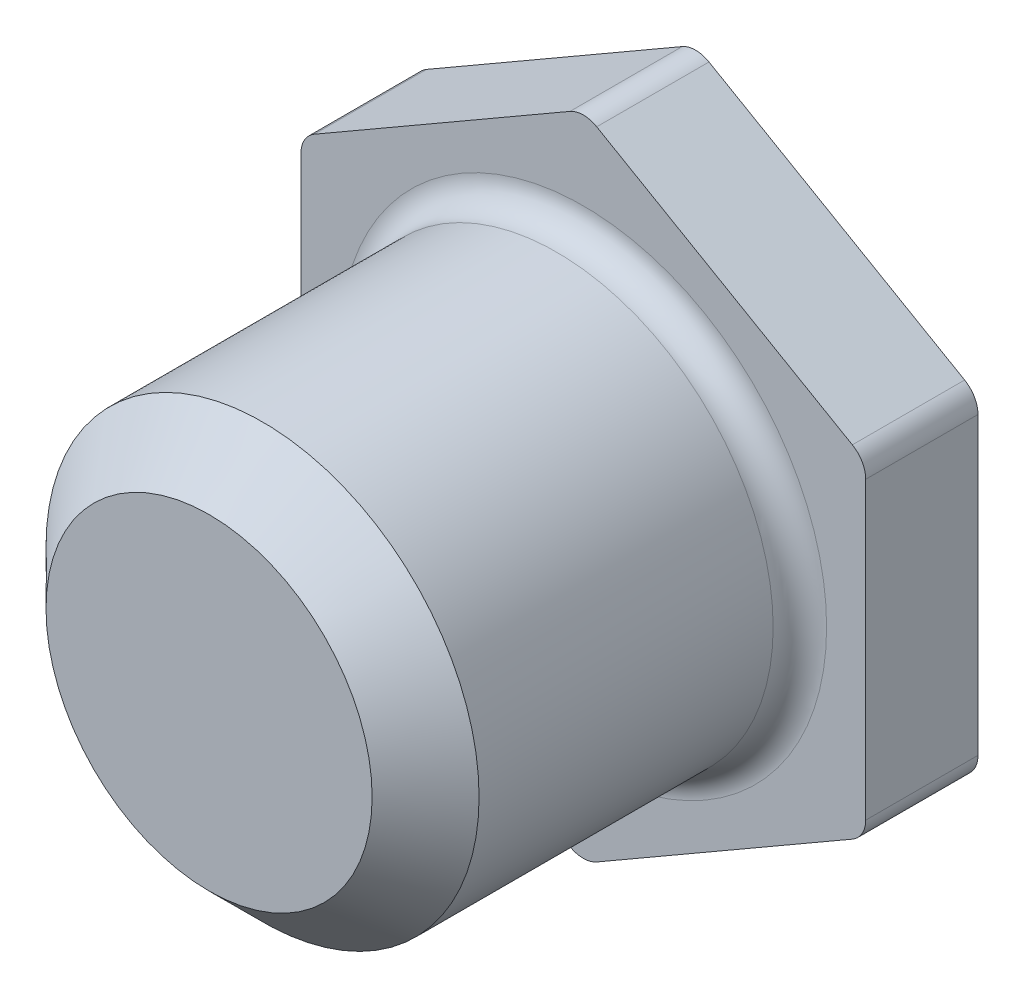
ISO-10303-21;
HEADER;
FILE_DESCRIPTION(('STEP AP214'),'2;1');
FILE_NAME('part.step','',(''),(''),'','','');
FILE_SCHEMA(('AUTOMOTIVE_DESIGN { 1 0 10303 214 1 1 1 1 }'));
ENDSEC;
DATA;
#1=APPLICATION_CONTEXT('core data for automotive mechanical design processes');
#2=APPLICATION_PROTOCOL_DEFINITION('international standard','automotive_design',2000,#1);
#3=PRODUCT_CONTEXT('',#1,'mechanical');
#4=PRODUCT('Part','Part','',(#3));
#5=PRODUCT_RELATED_PRODUCT_CATEGORY('part','',(#4));
#6=PRODUCT_DEFINITION_FORMATION('','',#4);
#7=PRODUCT_DEFINITION_CONTEXT('part definition',#1,'design');
#8=PRODUCT_DEFINITION('design','',#6,#7);
#9=PRODUCT_DEFINITION_SHAPE('','',#8);
#10=(LENGTH_UNIT() NAMED_UNIT(*) SI_UNIT(.MILLI.,.METRE.));
#11=(NAMED_UNIT(*) PLANE_ANGLE_UNIT() SI_UNIT($,.RADIAN.));
#12=(NAMED_UNIT(*) SI_UNIT($,.STERADIAN.) SOLID_ANGLE_UNIT());
#13=UNCERTAINTY_MEASURE_WITH_UNIT(LENGTH_MEASURE(1.E-05),#10,'distance_accuracy_value','');
#14=(GEOMETRIC_REPRESENTATION_CONTEXT(3) GLOBAL_UNCERTAINTY_ASSIGNED_CONTEXT((#13)) GLOBAL_UNIT_ASSIGNED_CONTEXT((#10,
#11,#12)) REPRESENTATION_CONTEXT('',''));
#15=CARTESIAN_POINT('',(0.,0.,0.));
#16=DIRECTION('',(0.,0.,1.));
#17=DIRECTION('',(1.,0.,0.));
#18=AXIS2_PLACEMENT_3D('',#15,#16,#17);
#19=CARTESIAN_POINT('',(5.28131212160006,-3.04916697508023,2.1));
#20=DIRECTION('',(-1.,0.,0.));
#21=DIRECTION('',(0.,-1.,0.));
#22=AXIS2_PLACEMENT_3D('',#19,#20,#21);
#23=PLANE('',#22);
#24=DIRECTION('',(0.,1.,0.));
#25=VECTOR('',#24,1.);
#26=CARTESIAN_POINT('',(5.28131212160006,-3.04916697508023,2.1));
#27=LINE('',#26,#25);
#28=CARTESIAN_POINT('',(5.28131212160006,-2.76049184048542,2.1));
#29=VERTEX_POINT('',#28);
#30=CARTESIAN_POINT('',(5.28131212160006,2.76049184048542,2.1));
#31=VERTEX_POINT('',#30);
#32=EDGE_CURVE('E145',#29,#31,#27,.T.);
#33=ORIENTED_EDGE('',*,*,#32,.F.);
#34=DIRECTION('',(0.,0.,-1.));
#35=VECTOR('',#34,1.);
#36=CARTESIAN_POINT('',(5.28131212160006,-2.76049184048542,2.1));
#37=LINE('',#36,#35);
#38=CARTESIAN_POINT('',(5.28131212160006,-2.76049184048542,0.));
#39=VERTEX_POINT('',#38);
#40=EDGE_CURVE('E159',#29,#39,#37,.T.);
#41=ORIENTED_EDGE('',*,*,#40,.T.);
#42=DIRECTION('',(0.,1.,0.));
#43=VECTOR('',#42,1.);
#44=CARTESIAN_POINT('',(5.28131212160006,-3.04916697508023,0.));
#45=LINE('',#44,#43);
#46=CARTESIAN_POINT('',(5.28131212160006,2.76049184048542,0.));
#47=VERTEX_POINT('',#46);
#48=EDGE_CURVE('E320',#39,#47,#45,.T.);
#49=ORIENTED_EDGE('',*,*,#48,.T.);
#50=DIRECTION('',(0.,0.,-1.));
#51=VECTOR('',#50,1.);
#52=CARTESIAN_POINT('',(5.28131212160006,2.76049184048542,2.1));
#53=LINE('',#52,#51);
#54=EDGE_CURVE('E161',#47,#31,#53,.F.);
#55=ORIENTED_EDGE('',*,*,#54,.T.);
#56=EDGE_LOOP('',(#33,#41,#49,#55));
#57=FACE_BOUND('',#56,.T.);
#58=ADVANCED_FACE('F47',(#57),#23,.F.);
#59=CARTESIAN_POINT('',(5.28131212160006,3.04916697508023,2.1));
#60=DIRECTION('',(-0.5,-0.866025403784439,0.));
#61=DIRECTION('',(0.866025403784439,-0.5,0.));
#62=AXIS2_PLACEMENT_3D('',#59,#60,#61);
#63=PLANE('',#62);
#64=DIRECTION('',(-0.866025403784439,0.5,0.));
#65=VECTOR('',#64,1.);
#66=CARTESIAN_POINT('',(5.28131212160006,3.04916697508023,2.1));
#67=LINE('',#66,#65);
#68=CARTESIAN_POINT('',(5.03131212160006,3.19350454237764,2.1));
#69=VERTEX_POINT('',#68);
#70=CARTESIAN_POINT('',(0.249999999999999,5.95399638286306,2.1));
#71=VERTEX_POINT('',#70);
#72=EDGE_CURVE('E163',#69,#71,#67,.T.);
#73=ORIENTED_EDGE('',*,*,#72,.F.);
#74=DIRECTION('',(0.,0.,-1.));
#75=VECTOR('',#74,1.);
#76=CARTESIAN_POINT('',(5.03131212160006,3.19350454237764,2.1));
#77=LINE('',#76,#75);
#78=CARTESIAN_POINT('',(5.03131212160006,3.19350454237764,0.));
#79=VERTEX_POINT('',#78);
#80=EDGE_CURVE('E173',#69,#79,#77,.T.);
#81=ORIENTED_EDGE('',*,*,#80,.T.);
#82=DIRECTION('',(-0.866025403784439,0.5,0.));
#83=VECTOR('',#82,1.);
#84=CARTESIAN_POINT('',(5.28131212160006,3.04916697508023,0.));
#85=LINE('',#84,#83);
#86=CARTESIAN_POINT('',(0.249999999999999,5.95399638286306,0.));
#87=VERTEX_POINT('',#86);
#88=EDGE_CURVE('E323',#79,#87,#85,.T.);
#89=ORIENTED_EDGE('',*,*,#88,.T.);
#90=DIRECTION('',(0.,0.,-1.));
#91=VECTOR('',#90,1.);
#92=CARTESIAN_POINT('',(0.249999999999999,5.95399638286306,2.1));
#93=LINE('',#92,#91);
#94=EDGE_CURVE('E169',#87,#71,#93,.F.);
#95=ORIENTED_EDGE('',*,*,#94,.T.);
#96=EDGE_LOOP('',(#73,#81,#89,#95));
#97=FACE_BOUND('',#96,.T.);
#98=ADVANCED_FACE('F197',(#97),#63,.F.);
#99=CARTESIAN_POINT('',(0.,6.09833395016046,2.1));
#100=DIRECTION('',(0.5,-0.866025403784439,0.));
#101=DIRECTION('',(0.866025403784439,0.5,0.));
#102=AXIS2_PLACEMENT_3D('',#99,#100,#101);
#103=PLANE('',#102);
#104=DIRECTION('',(-0.866025403784439,-0.5,0.));
#105=VECTOR('',#104,1.);
#106=CARTESIAN_POINT('',(0.,6.09833395016046,0.));
#107=LINE('',#106,#105);
#108=CARTESIAN_POINT('',(-0.250000000000001,5.95399638286306,0.));
#109=VERTEX_POINT('',#108);
#110=CARTESIAN_POINT('',(-5.03131212160006,3.19350454237764,0.));
#111=VERTEX_POINT('',#110);
#112=EDGE_CURVE('E326',#109,#111,#107,.T.);
#113=ORIENTED_EDGE('',*,*,#112,.T.);
#114=DIRECTION('',(0.,0.,-1.));
#115=VECTOR('',#114,1.);
#116=CARTESIAN_POINT('',(-5.03131212160006,3.19350454237764,2.1));
#117=LINE('',#116,#115);
#118=CARTESIAN_POINT('',(-5.03131212160006,3.19350454237764,2.1));
#119=VERTEX_POINT('',#118);
#120=EDGE_CURVE('E276',#111,#119,#117,.F.);
#121=ORIENTED_EDGE('',*,*,#120,.T.);
#122=DIRECTION('',(-0.866025403784439,-0.5,0.));
#123=VECTOR('',#122,1.);
#124=CARTESIAN_POINT('',(0.,6.09833395016046,2.1));
#125=LINE('',#124,#123);
#126=CARTESIAN_POINT('',(-0.250000000000001,5.95399638286306,2.1));
#127=VERTEX_POINT('',#126);
#128=EDGE_CURVE('E360',#127,#119,#125,.T.);
#129=ORIENTED_EDGE('',*,*,#128,.F.);
#130=DIRECTION('',(0.,0.,-1.));
#131=VECTOR('',#130,1.);
#132=CARTESIAN_POINT('',(-0.250000000000001,5.95399638286306,2.1));
#133=LINE('',#132,#131);
#134=EDGE_CURVE('E272',#127,#109,#133,.T.);
#135=ORIENTED_EDGE('',*,*,#134,.T.);
#136=EDGE_LOOP('',(#113,#121,#129,#135));
#137=FACE_BOUND('',#136,.T.);
#138=ADVANCED_FACE('F202',(#137),#103,.F.);
#139=CARTESIAN_POINT('',(-5.28131212160006,3.04916697508023,2.1));
#140=DIRECTION('',(1.,0.,0.));
#141=DIRECTION('',(0.,0.,-1.));
#142=AXIS2_PLACEMENT_3D('',#139,#140,#141);
#143=PLANE('',#142);
#144=DIRECTION('',(0.,-1.,0.));
#145=VECTOR('',#144,1.);
#146=CARTESIAN_POINT('',(-5.28131212160006,3.04916697508023,2.1));
#147=LINE('',#146,#145);
#148=CARTESIAN_POINT('',(-5.28131212160006,2.76049184048542,2.1));
#149=VERTEX_POINT('',#148);
#150=CARTESIAN_POINT('',(-5.28131212160006,-2.76049184048542,2.1));
#151=VERTEX_POINT('',#150);
#152=EDGE_CURVE('E316',#149,#151,#147,.T.);
#153=ORIENTED_EDGE('',*,*,#152,.F.);
#154=DIRECTION('',(0.,0.,-1.));
#155=VECTOR('',#154,1.);
#156=CARTESIAN_POINT('',(-5.28131212160006,2.76049184048542,2.1));
#157=LINE('',#156,#155);
#158=CARTESIAN_POINT('',(-5.28131212160006,2.76049184048542,0.));
#159=VERTEX_POINT('',#158);
#160=EDGE_CURVE('E253',#149,#159,#157,.T.);
#161=ORIENTED_EDGE('',*,*,#160,.T.);
#162=DIRECTION('',(0.,-1.,0.));
#163=VECTOR('',#162,1.);
#164=CARTESIAN_POINT('',(-5.28131212160006,3.04916697508023,0.));
#165=LINE('',#164,#163);
#166=CARTESIAN_POINT('',(-5.28131212160006,-2.76049184048542,0.));
#167=VERTEX_POINT('',#166);
#168=EDGE_CURVE('E304',#159,#167,#165,.T.);
#169=ORIENTED_EDGE('',*,*,#168,.T.);
#170=DIRECTION('',(0.,0.,-1.));
#171=VECTOR('',#170,1.);
#172=CARTESIAN_POINT('',(-5.28131212160006,-2.76049184048542,2.1));
#173=LINE('',#172,#171);
#174=EDGE_CURVE('E250',#167,#151,#173,.F.);
#175=ORIENTED_EDGE('',*,*,#174,.T.);
#176=EDGE_LOOP('',(#153,#161,#169,#175));
#177=FACE_BOUND('',#176,.T.);
#178=ADVANCED_FACE('F334',(#177),#143,.F.);
#179=CARTESIAN_POINT('',(-5.28131212160006,-3.04916697508023,2.1));
#180=DIRECTION('',(0.5,0.866025403784439,0.));
#181=DIRECTION('',(-0.866025403784439,0.5,0.));
#182=AXIS2_PLACEMENT_3D('',#179,#180,#181);
#183=PLANE('',#182);
#184=DIRECTION('',(0.866025403784439,-0.5,0.));
#185=VECTOR('',#184,1.);
#186=CARTESIAN_POINT('',(-5.28131212160006,-3.04916697508023,2.1));
#187=LINE('',#186,#185);
#188=CARTESIAN_POINT('',(-5.03131212160006,-3.19350454237764,2.1));
#189=VERTEX_POINT('',#188);
#190=CARTESIAN_POINT('',(-0.25,-5.95399638286305,2.1));
#191=VERTEX_POINT('',#190);
#192=EDGE_CURVE('E312',#189,#191,#187,.T.);
#193=ORIENTED_EDGE('',*,*,#192,.F.);
#194=DIRECTION('',(0.,0.,-1.));
#195=VECTOR('',#194,1.);
#196=CARTESIAN_POINT('',(-5.03131212160006,-3.19350454237764,2.1));
#197=LINE('',#196,#195);
#198=CARTESIAN_POINT('',(-5.03131212160006,-3.19350454237764,0.));
#199=VERTEX_POINT('',#198);
#200=EDGE_CURVE('E282',#189,#199,#197,.T.);
#201=ORIENTED_EDGE('',*,*,#200,.T.);
#202=DIRECTION('',(0.866025403784439,-0.5,0.));
#203=VECTOR('',#202,1.);
#204=CARTESIAN_POINT('',(-5.28131212160006,-3.04916697508023,0.));
#205=LINE('',#204,#203);
#206=CARTESIAN_POINT('',(-0.25,-5.95399638286305,0.));
#207=VERTEX_POINT('',#206);
#208=EDGE_CURVE('E301',#199,#207,#205,.T.);
#209=ORIENTED_EDGE('',*,*,#208,.T.);
#210=DIRECTION('',(0.,0.,-1.));
#211=VECTOR('',#210,1.);
#212=CARTESIAN_POINT('',(-0.25,-5.95399638286305,2.1));
#213=LINE('',#212,#211);
#214=EDGE_CURVE('E279',#207,#191,#213,.F.);
#215=ORIENTED_EDGE('',*,*,#214,.T.);
#216=EDGE_LOOP('',(#193,#201,#209,#215));
#217=FACE_BOUND('',#216,.T.);
#218=ADVANCED_FACE('F341',(#217),#183,.F.);
#219=CARTESIAN_POINT('',(0.,-6.09833395016046,2.1));
#220=DIRECTION('',(-0.5,0.866025403784439,0.));
#221=DIRECTION('',(-0.866025403784439,-0.5,0.));
#222=AXIS2_PLACEMENT_3D('',#219,#220,#221);
#223=PLANE('',#222);
#224=DIRECTION('',(0.866025403784439,0.5,0.));
#225=VECTOR('',#224,1.);
#226=CARTESIAN_POINT('',(0.,-6.09833395016046,2.1));
#227=LINE('',#226,#225);
#228=CARTESIAN_POINT('',(0.25,-5.95399638286305,2.1));
#229=VERTEX_POINT('',#228);
#230=CARTESIAN_POINT('',(5.03131212160006,-3.19350454237764,2.1));
#231=VERTEX_POINT('',#230);
#232=EDGE_CURVE('E148',#229,#231,#227,.T.);
#233=ORIENTED_EDGE('',*,*,#232,.F.);
#234=DIRECTION('',(0.,0.,-1.));
#235=VECTOR('',#234,1.);
#236=CARTESIAN_POINT('',(0.25,-5.95399638286305,2.1));
#237=LINE('',#236,#235);
#238=CARTESIAN_POINT('',(0.25,-5.95399638286305,0.));
#239=VERTEX_POINT('',#238);
#240=EDGE_CURVE('E175',#229,#239,#237,.T.);
#241=ORIENTED_EDGE('',*,*,#240,.T.);
#242=DIRECTION('',(0.866025403784439,0.5,0.));
#243=VECTOR('',#242,1.);
#244=CARTESIAN_POINT('',(0.,-6.09833395016046,0.));
#245=LINE('',#244,#243);
#246=CARTESIAN_POINT('',(5.03131212160006,-3.19350454237764,0.));
#247=VERTEX_POINT('',#246);
#248=EDGE_CURVE('E164',#239,#247,#245,.T.);
#249=ORIENTED_EDGE('',*,*,#248,.T.);
#250=DIRECTION('',(0.,0.,-1.));
#251=VECTOR('',#250,1.);
#252=CARTESIAN_POINT('',(5.03131212160006,-3.19350454237764,2.1));
#253=LINE('',#252,#251);
#254=EDGE_CURVE('E286',#247,#231,#253,.F.);
#255=ORIENTED_EDGE('',*,*,#254,.T.);
#256=EDGE_LOOP('',(#233,#241,#249,#255));
#257=FACE_BOUND('',#256,.T.);
#258=ADVANCED_FACE('F294',(#257),#223,.F.);
#259=CARTESIAN_POINT('',(0.,0.,2.1));
#260=DIRECTION('',(0.,0.,1.));
#261=DIRECTION('',(1.,0.,0.));
#262=AXIS2_PLACEMENT_3D('',#259,#260,#261);
#263=PLANE('',#262);
#264=CARTESIAN_POINT('',(0.,0.,2.1));
#265=DIRECTION('',(0.,0.,1.));
#266=DIRECTION('',(1.,0.,0.));
#267=AXIS2_PLACEMENT_3D('',#264,#265,#266);
#268=CIRCLE('',#267,4.55);
#269=CARTESIAN_POINT('',(4.55,0.,2.1));
#270=VERTEX_POINT('',#269);
#271=EDGE_CURVE('E246',#270,#270,#268,.F.);
#272=ORIENTED_EDGE('',*,*,#271,.T.);
#273=EDGE_LOOP('',(#272));
#274=FACE_BOUND('',#273,.T.);
#275=ORIENTED_EDGE('',*,*,#128,.T.);
#276=CARTESIAN_POINT('',(-4.78131212160006,2.76049184048542,2.1));
#277=DIRECTION('',(0.,0.,1.));
#278=DIRECTION('',(1.,0.,0.));
#279=AXIS2_PLACEMENT_3D('',#276,#277,#278);
#280=CIRCLE('',#279,0.5);
#281=EDGE_CURVE('E243',#119,#149,#280,.T.);
#282=ORIENTED_EDGE('',*,*,#281,.T.);
#283=ORIENTED_EDGE('',*,*,#152,.T.);
#284=CARTESIAN_POINT('',(-4.78131212160006,-2.76049184048542,2.1));
#285=DIRECTION('',(0.,0.,1.));
#286=DIRECTION('',(1.,0.,0.));
#287=AXIS2_PLACEMENT_3D('',#284,#285,#286);
#288=CIRCLE('',#287,0.5);
#289=EDGE_CURVE('E240',#151,#189,#288,.T.);
#290=ORIENTED_EDGE('',*,*,#289,.T.);
#291=ORIENTED_EDGE('',*,*,#192,.T.);
#292=CARTESIAN_POINT('',(0.,-5.52098368097083,2.1));
#293=DIRECTION('',(0.,0.,1.));
#294=DIRECTION('',(1.,0.,0.));
#295=AXIS2_PLACEMENT_3D('',#292,#293,#294);
#296=CIRCLE('',#295,0.5);
#297=EDGE_CURVE('E153',#191,#229,#296,.T.);
#298=ORIENTED_EDGE('',*,*,#297,.T.);
#299=ORIENTED_EDGE('',*,*,#232,.T.);
#300=CARTESIAN_POINT('',(4.78131212160006,-2.76049184048542,2.1));
#301=DIRECTION('',(0.,0.,1.));
#302=DIRECTION('',(1.,0.,0.));
#303=AXIS2_PLACEMENT_3D('',#300,#301,#302);
#304=CIRCLE('',#303,0.5);
#305=EDGE_CURVE('E141',#231,#29,#304,.T.);
#306=ORIENTED_EDGE('',*,*,#305,.T.);
#307=ORIENTED_EDGE('',*,*,#32,.T.);
#308=CARTESIAN_POINT('',(4.78131212160006,2.76049184048542,2.1));
#309=DIRECTION('',(0.,0.,1.));
#310=DIRECTION('',(1.,0.,0.));
#311=AXIS2_PLACEMENT_3D('',#308,#309,#310);
#312=CIRCLE('',#311,0.5);
#313=EDGE_CURVE('E154',#31,#69,#312,.T.);
#314=ORIENTED_EDGE('',*,*,#313,.T.);
#315=ORIENTED_EDGE('',*,*,#72,.T.);
#316=CARTESIAN_POINT('',(0.,5.52098368097084,2.1));
#317=DIRECTION('',(0.,0.,1.));
#318=DIRECTION('',(1.,0.,0.));
#319=AXIS2_PLACEMENT_3D('',#316,#317,#318);
#320=CIRCLE('',#319,0.5);
#321=EDGE_CURVE('E231',#71,#127,#320,.T.);
#322=ORIENTED_EDGE('',*,*,#321,.T.);
#323=EDGE_LOOP('',(#275,#282,#283,#290,#291,#298,#299,#306,#307,#314,#315,#322));
#324=FACE_BOUND('',#323,.T.);
#325=ADVANCED_FACE('F144',(#274,#324),#263,.T.);
#326=CARTESIAN_POINT('',(0.,0.,0.));
#327=DIRECTION('',(0.,0.,1.));
#328=DIRECTION('',(1.,0.,0.));
#329=AXIS2_PLACEMENT_3D('',#326,#327,#328);
#330=PLANE('',#329);
#331=ORIENTED_EDGE('',*,*,#168,.F.);
#332=CARTESIAN_POINT('',(-4.78131212160006,2.76049184048542,0.));
#333=DIRECTION('',(0.,0.,1.));
#334=DIRECTION('',(1.,0.,0.));
#335=AXIS2_PLACEMENT_3D('',#332,#333,#334);
#336=CIRCLE('',#335,0.5);
#337=EDGE_CURVE('E269',#159,#111,#336,.F.);
#338=ORIENTED_EDGE('',*,*,#337,.T.);
#339=ORIENTED_EDGE('',*,*,#112,.F.);
#340=CARTESIAN_POINT('',(0.,5.52098368097084,0.));
#341=DIRECTION('',(0.,0.,1.));
#342=DIRECTION('',(1.,0.,0.));
#343=AXIS2_PLACEMENT_3D('',#340,#341,#342);
#344=CIRCLE('',#343,0.5);
#345=EDGE_CURVE('E64',#109,#87,#344,.F.);
#346=ORIENTED_EDGE('',*,*,#345,.T.);
#347=ORIENTED_EDGE('',*,*,#88,.F.);
#348=CARTESIAN_POINT('',(4.78131212160006,2.76049184048542,0.));
#349=DIRECTION('',(0.,0.,1.));
#350=DIRECTION('',(1.,0.,0.));
#351=AXIS2_PLACEMENT_3D('',#348,#349,#350);
#352=CIRCLE('',#351,0.5);
#353=EDGE_CURVE('E72',#79,#47,#352,.F.);
#354=ORIENTED_EDGE('',*,*,#353,.T.);
#355=ORIENTED_EDGE('',*,*,#48,.F.);
#356=CARTESIAN_POINT('',(4.78131212160006,-2.76049184048542,0.));
#357=DIRECTION('',(0.,0.,1.));
#358=DIRECTION('',(1.,0.,0.));
#359=AXIS2_PLACEMENT_3D('',#356,#357,#358);
#360=CIRCLE('',#359,0.5);
#361=EDGE_CURVE('E167',#39,#247,#360,.F.);
#362=ORIENTED_EDGE('',*,*,#361,.T.);
#363=ORIENTED_EDGE('',*,*,#248,.F.);
#364=CARTESIAN_POINT('',(0.,-5.52098368097083,0.));
#365=DIRECTION('',(0.,0.,1.));
#366=DIRECTION('',(1.,0.,0.));
#367=AXIS2_PLACEMENT_3D('',#364,#365,#366);
#368=CIRCLE('',#367,0.5);
#369=EDGE_CURVE('E263',#239,#207,#368,.F.);
#370=ORIENTED_EDGE('',*,*,#369,.T.);
#371=ORIENTED_EDGE('',*,*,#208,.F.);
#372=CARTESIAN_POINT('',(-4.78131212160006,-2.76049184048542,0.));
#373=DIRECTION('',(0.,0.,1.));
#374=DIRECTION('',(1.,0.,0.));
#375=AXIS2_PLACEMENT_3D('',#372,#373,#374);
#376=CIRCLE('',#375,0.5);
#377=EDGE_CURVE('E266',#199,#167,#376,.F.);
#378=ORIENTED_EDGE('',*,*,#377,.T.);
#379=EDGE_LOOP('',(#331,#338,#339,#346,#347,#354,#355,#362,#363,#370,#371,#378));
#380=FACE_BOUND('',#379,.T.);
#381=ADVANCED_FACE('F297',(#380),#330,.F.);
#382=CARTESIAN_POINT('',(0.,0.,9.1));
#383=DIRECTION('',(0.,0.,-1.));
#384=DIRECTION('',(-1.,0.,0.));
#385=AXIS2_PLACEMENT_3D('',#382,#383,#384);
#386=CYLINDRICAL_SURFACE('',#385,4.05);
#387=CARTESIAN_POINT('',(0.,0.,8.1));
#388=DIRECTION('',(0.,0.,1.));
#389=DIRECTION('',(1.,0.,0.));
#390=AXIS2_PLACEMENT_3D('',#387,#388,#389);
#391=CIRCLE('',#390,4.05);
#392=CARTESIAN_POINT('',(4.05,0.,8.1));
#393=VERTEX_POINT('',#392);
#394=EDGE_CURVE('E11',#393,#393,#391,.F.);
#395=ORIENTED_EDGE('',*,*,#394,.T.);
#396=EDGE_LOOP('',(#395));
#397=FACE_BOUND('',#396,.T.);
#398=CARTESIAN_POINT('',(0.,0.,2.6));
#399=DIRECTION('',(0.,0.,1.));
#400=DIRECTION('',(1.,0.,0.));
#401=AXIS2_PLACEMENT_3D('',#398,#399,#400);
#402=CIRCLE('',#401,4.05);
#403=CARTESIAN_POINT('',(4.05,0.,2.6));
#404=VERTEX_POINT('',#403);
#405=EDGE_CURVE('E234',#404,#404,#402,.T.);
#406=ORIENTED_EDGE('',*,*,#405,.T.);
#407=EDGE_LOOP('',(#406));
#408=FACE_BOUND('',#407,.T.);
#409=ADVANCED_FACE('F404',(#397,#408),#386,.T.);
#410=CARTESIAN_POINT('',(0.,0.,9.1));
#411=DIRECTION('',(0.,0.,1.));
#412=DIRECTION('',(1.,0.,0.));
#413=AXIS2_PLACEMENT_3D('',#410,#411,#412);
#414=PLANE('',#413);
#415=CARTESIAN_POINT('',(0.,0.,9.1));
#416=DIRECTION('',(0.,0.,1.));
#417=DIRECTION('',(1.,0.,0.));
#418=AXIS2_PLACEMENT_3D('',#415,#416,#417);
#419=CIRCLE('',#418,3.05);
#420=CARTESIAN_POINT('',(3.05,0.,9.1));
#421=VERTEX_POINT('',#420);
#422=EDGE_CURVE('E57',#421,#421,#419,.T.);
#423=ORIENTED_EDGE('',*,*,#422,.T.);
#424=EDGE_LOOP('',(#423));
#425=FACE_BOUND('',#424,.T.);
#426=ADVANCED_FACE('F184',(#425),#414,.T.);
#427=CARTESIAN_POINT('',(0.,0.,2.6));
#428=DIRECTION('',(0.,0.,1.));
#429=DIRECTION('',(1.,0.,0.));
#430=AXIS2_PLACEMENT_3D('',#427,#428,#429);
#431=TOROIDAL_SURFACE('',#430,4.55,0.5);
#432=ORIENTED_EDGE('',*,*,#271,.F.);
#433=EDGE_LOOP('',(#432));
#434=FACE_BOUND('',#433,.T.);
#435=ORIENTED_EDGE('',*,*,#405,.F.);
#436=EDGE_LOOP('',(#435));
#437=FACE_BOUND('',#436,.T.);
#438=ADVANCED_FACE('F207',(#434,#437),#431,.F.);
#439=CARTESIAN_POINT('',(-4.78131212160006,2.76049184048542,2.1));
#440=DIRECTION('',(0.,0.,-1.));
#441=DIRECTION('',(-1.,0.,0.));
#442=AXIS2_PLACEMENT_3D('',#439,#440,#441);
#443=CYLINDRICAL_SURFACE('',#442,0.5);
#444=ORIENTED_EDGE('',*,*,#281,.F.);
#445=ORIENTED_EDGE('',*,*,#120,.F.);
#446=ORIENTED_EDGE('',*,*,#337,.F.);
#447=ORIENTED_EDGE('',*,*,#160,.F.);
#448=EDGE_LOOP('',(#444,#445,#446,#447));
#449=FACE_BOUND('',#448,.T.);
#450=ADVANCED_FACE('F210',(#449),#443,.T.);
#451=CARTESIAN_POINT('',(-4.78131212160006,-2.76049184048542,2.1));
#452=DIRECTION('',(0.,0.,-1.));
#453=DIRECTION('',(-1.,0.,0.));
#454=AXIS2_PLACEMENT_3D('',#451,#452,#453);
#455=CYLINDRICAL_SURFACE('',#454,0.5);
#456=ORIENTED_EDGE('',*,*,#289,.F.);
#457=ORIENTED_EDGE('',*,*,#174,.F.);
#458=ORIENTED_EDGE('',*,*,#377,.F.);
#459=ORIENTED_EDGE('',*,*,#200,.F.);
#460=EDGE_LOOP('',(#456,#457,#458,#459));
#461=FACE_BOUND('',#460,.T.);
#462=ADVANCED_FACE('F214',(#461),#455,.T.);
#463=CARTESIAN_POINT('',(0.,-5.52098368097083,2.1));
#464=DIRECTION('',(0.,0.,-1.));
#465=DIRECTION('',(-1.,0.,0.));
#466=AXIS2_PLACEMENT_3D('',#463,#464,#465);
#467=CYLINDRICAL_SURFACE('',#466,0.5);
#468=ORIENTED_EDGE('',*,*,#297,.F.);
#469=ORIENTED_EDGE('',*,*,#214,.F.);
#470=ORIENTED_EDGE('',*,*,#369,.F.);
#471=ORIENTED_EDGE('',*,*,#240,.F.);
#472=EDGE_LOOP('',(#468,#469,#470,#471));
#473=FACE_BOUND('',#472,.T.);
#474=ADVANCED_FACE('F218',(#473),#467,.T.);
#475=CARTESIAN_POINT('',(4.78131212160006,-2.76049184048542,2.1));
#476=DIRECTION('',(0.,0.,-1.));
#477=DIRECTION('',(-1.,0.,0.));
#478=AXIS2_PLACEMENT_3D('',#475,#476,#477);
#479=CYLINDRICAL_SURFACE('',#478,0.5);
#480=ORIENTED_EDGE('',*,*,#305,.F.);
#481=ORIENTED_EDGE('',*,*,#254,.F.);
#482=ORIENTED_EDGE('',*,*,#361,.F.);
#483=ORIENTED_EDGE('',*,*,#40,.F.);
#484=EDGE_LOOP('',(#480,#481,#482,#483));
#485=FACE_BOUND('',#484,.T.);
#486=ADVANCED_FACE('F166',(#485),#479,.T.);
#487=CARTESIAN_POINT('',(4.78131212160006,2.76049184048542,2.1));
#488=DIRECTION('',(0.,0.,-1.));
#489=DIRECTION('',(-1.,0.,0.));
#490=AXIS2_PLACEMENT_3D('',#487,#488,#489);
#491=CYLINDRICAL_SURFACE('',#490,0.5);
#492=ORIENTED_EDGE('',*,*,#313,.F.);
#493=ORIENTED_EDGE('',*,*,#54,.F.);
#494=ORIENTED_EDGE('',*,*,#353,.F.);
#495=ORIENTED_EDGE('',*,*,#80,.F.);
#496=EDGE_LOOP('',(#492,#493,#494,#495));
#497=FACE_BOUND('',#496,.T.);
#498=ADVANCED_FACE('F193',(#497),#491,.T.);
#499=CARTESIAN_POINT('',(0.,5.52098368097084,2.1));
#500=DIRECTION('',(0.,0.,-1.));
#501=DIRECTION('',(-1.,0.,0.));
#502=AXIS2_PLACEMENT_3D('',#499,#500,#501);
#503=CYLINDRICAL_SURFACE('',#502,0.5);
#504=ORIENTED_EDGE('',*,*,#321,.F.);
#505=ORIENTED_EDGE('',*,*,#94,.F.);
#506=ORIENTED_EDGE('',*,*,#345,.F.);
#507=ORIENTED_EDGE('',*,*,#134,.F.);
#508=EDGE_LOOP('',(#504,#505,#506,#507));
#509=FACE_BOUND('',#508,.T.);
#510=ADVANCED_FACE('F187',(#509),#503,.T.);
#511=CARTESIAN_POINT('',(0.,0.,9.1));
#512=DIRECTION('',(0.,0.,-1.));
#513=DIRECTION('',(-1.,0.,0.));
#514=AXIS2_PLACEMENT_3D('',#511,#512,#513);
#515=CONICAL_SURFACE('',#514,3.05,0.785398163397447);
#516=ORIENTED_EDGE('',*,*,#394,.F.);
#517=EDGE_LOOP('',(#516));
#518=FACE_BOUND('',#517,.T.);
#519=ORIENTED_EDGE('',*,*,#422,.F.);
#520=EDGE_LOOP('',(#519));
#521=FACE_BOUND('',#520,.T.);
#522=ADVANCED_FACE('F50',(#518,#521),#515,.T.);
#523=CLOSED_SHELL('',(#58,#98,#138,#178,#218,#258,#325,#381,#409,#426,#438,#450,#462,#474,#486,
#498,#510,#522));
#524=MANIFOLD_SOLID_BREP('B2',#523);
#525=ADVANCED_BREP_SHAPE_REPRESENTATION('',(#18,#524),#14);
#526=SHAPE_DEFINITION_REPRESENTATION(#9,#525);
ENDSEC;
END-ISO-10303-21;
